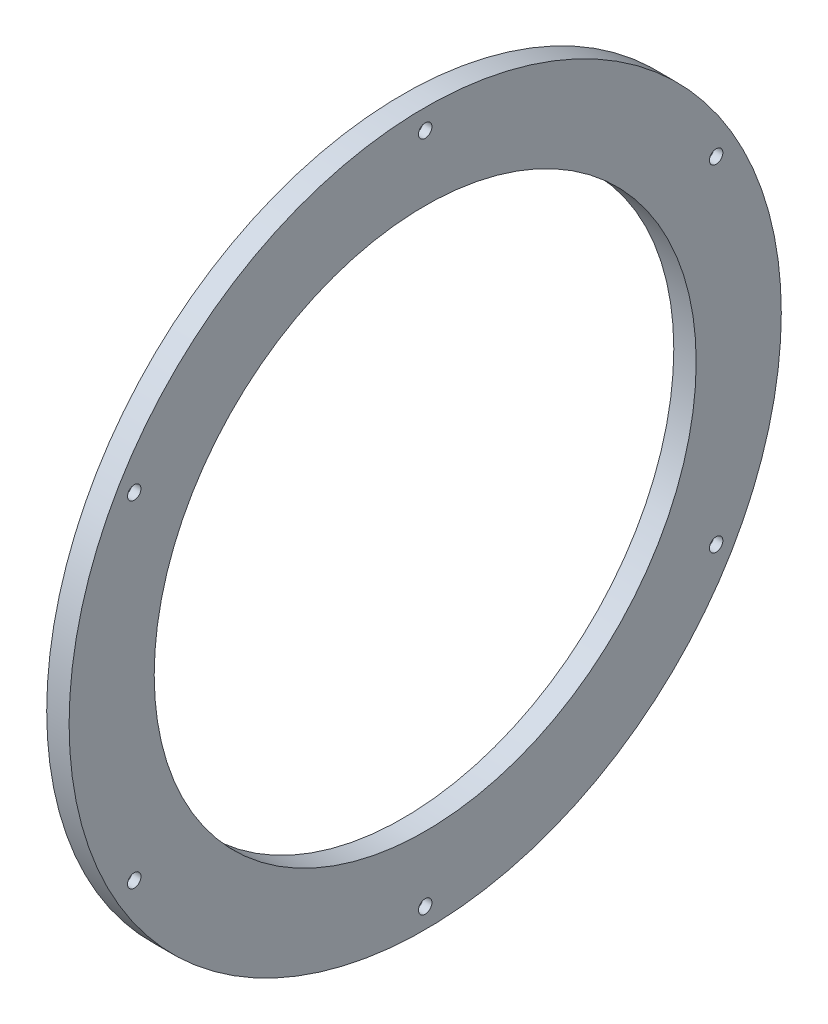
ISO-10303-21;
HEADER;
FILE_DESCRIPTION(('STEP AP214'),'2;1');
FILE_NAME('part.step','',(''),(''),'','','');
FILE_SCHEMA(('AUTOMOTIVE_DESIGN { 1 0 10303 214 1 1 1 1 }'));
ENDSEC;
DATA;
#1=APPLICATION_CONTEXT('core data for automotive mechanical design processes');
#2=APPLICATION_PROTOCOL_DEFINITION('international standard','automotive_design',2000,#1);
#3=PRODUCT_CONTEXT('',#1,'mechanical');
#4=PRODUCT('Part','Part','',(#3));
#5=PRODUCT_RELATED_PRODUCT_CATEGORY('part','',(#4));
#6=PRODUCT_DEFINITION_FORMATION('','',#4);
#7=PRODUCT_DEFINITION_CONTEXT('part definition',#1,'design');
#8=PRODUCT_DEFINITION('design','',#6,#7);
#9=PRODUCT_DEFINITION_SHAPE('','',#8);
#10=(LENGTH_UNIT() NAMED_UNIT(*) SI_UNIT(.MILLI.,.METRE.));
#11=(NAMED_UNIT(*) PLANE_ANGLE_UNIT() SI_UNIT($,.RADIAN.));
#12=(NAMED_UNIT(*) SI_UNIT($,.STERADIAN.) SOLID_ANGLE_UNIT());
#13=UNCERTAINTY_MEASURE_WITH_UNIT(LENGTH_MEASURE(1.E-05),#10,'distance_accuracy_value','');
#14=(GEOMETRIC_REPRESENTATION_CONTEXT(3) GLOBAL_UNCERTAINTY_ASSIGNED_CONTEXT((#13)) GLOBAL_UNIT_ASSIGNED_CONTEXT((#10,
#11,#12)) REPRESENTATION_CONTEXT('',''));
#15=CARTESIAN_POINT('',(0.,0.,0.));
#16=DIRECTION('',(0.,0.,1.));
#17=DIRECTION('',(1.,0.,0.));
#18=AXIS2_PLACEMENT_3D('',#15,#16,#17);
#19=CARTESIAN_POINT('',(10.,0.,0.));
#20=DIRECTION('',(1.,0.,0.));
#21=DIRECTION('',(0.,0.,-1.));
#22=AXIS2_PLACEMENT_3D('',#19,#20,#21);
#23=PLANE('',#22);
#24=CARTESIAN_POINT('',(10.,150.,0.));
#25=DIRECTION('',(1.,0.,0.));
#26=DIRECTION('',(0.,0.,-1.));
#27=AXIS2_PLACEMENT_3D('',#24,#25,#26);
#28=CIRCLE('',#27,3.);
#29=CARTESIAN_POINT('',(10.,150.,-3.));
#30=VERTEX_POINT('',#29);
#31=EDGE_CURVE('E36',#30,#30,#28,.T.);
#32=ORIENTED_EDGE('',*,*,#31,.F.);
#33=EDGE_LOOP('',(#32));
#34=FACE_BOUND('',#33,.T.);
#35=CARTESIAN_POINT('',(10.,74.9999999999997,129.903810567666));
#36=DIRECTION('',(1.,0.,0.));
#37=DIRECTION('',(0.,0.,-1.));
#38=AXIS2_PLACEMENT_3D('',#35,#36,#37);
#39=CIRCLE('',#38,3.);
#40=CARTESIAN_POINT('',(10.,74.9999999999997,126.903810567666));
#41=VERTEX_POINT('',#40);
#42=EDGE_CURVE('E69',#41,#41,#39,.T.);
#43=ORIENTED_EDGE('',*,*,#42,.F.);
#44=EDGE_LOOP('',(#43));
#45=FACE_BOUND('',#44,.T.);
#46=CARTESIAN_POINT('',(10.,-75.0000000000006,129.903810567666));
#47=DIRECTION('',(1.,0.,0.));
#48=DIRECTION('',(0.,0.,-1.));
#49=AXIS2_PLACEMENT_3D('',#46,#47,#48);
#50=CIRCLE('',#49,3.);
#51=CARTESIAN_POINT('',(10.,-75.0000000000006,126.903810567666));
#52=VERTEX_POINT('',#51);
#53=EDGE_CURVE('E65',#52,#52,#50,.T.);
#54=ORIENTED_EDGE('',*,*,#53,.F.);
#55=EDGE_LOOP('',(#54));
#56=FACE_BOUND('',#55,.T.);
#57=CARTESIAN_POINT('',(10.,-150.,-1.04744440165294E-12));
#58=DIRECTION('',(1.,0.,0.));
#59=DIRECTION('',(0.,0.,-1.));
#60=AXIS2_PLACEMENT_3D('',#57,#58,#59);
#61=CIRCLE('',#60,3.);
#62=CARTESIAN_POINT('',(10.,-150.,-3.00000000000105));
#63=VERTEX_POINT('',#62);
#64=EDGE_CURVE('E60',#63,#63,#61,.T.);
#65=ORIENTED_EDGE('',*,*,#64,.F.);
#66=EDGE_LOOP('',(#65));
#67=FACE_BOUND('',#66,.T.);
#68=CARTESIAN_POINT('',(10.,-74.9999999999988,-129.903810567666));
#69=DIRECTION('',(1.,0.,0.));
#70=DIRECTION('',(0.,0.,-1.));
#71=AXIS2_PLACEMENT_3D('',#68,#69,#70);
#72=CIRCLE('',#71,3.);
#73=CARTESIAN_POINT('',(10.,-74.9999999999988,-132.903810567666));
#74=VERTEX_POINT('',#73);
#75=EDGE_CURVE('E55',#74,#74,#72,.T.);
#76=ORIENTED_EDGE('',*,*,#75,.F.);
#77=EDGE_LOOP('',(#76));
#78=FACE_BOUND('',#77,.T.);
#79=CARTESIAN_POINT('',(10.,75.0000000000015,-129.903810567665));
#80=DIRECTION('',(1.,0.,0.));
#81=DIRECTION('',(0.,0.,-1.));
#82=AXIS2_PLACEMENT_3D('',#79,#80,#81);
#83=CIRCLE('',#82,3.);
#84=CARTESIAN_POINT('',(10.,75.0000000000015,-132.903810567665));
#85=VERTEX_POINT('',#84);
#86=EDGE_CURVE('E51',#85,#85,#83,.T.);
#87=ORIENTED_EDGE('',*,*,#86,.F.);
#88=EDGE_LOOP('',(#87));
#89=FACE_BOUND('',#88,.T.);
#90=CARTESIAN_POINT('',(10.,0.,0.));
#91=DIRECTION('',(1.,0.,0.));
#92=DIRECTION('',(0.,0.,-1.));
#93=AXIS2_PLACEMENT_3D('',#90,#91,#92);
#94=CIRCLE('',#93,159.);
#95=CARTESIAN_POINT('',(10.,0.,-159.));
#96=VERTEX_POINT('',#95);
#97=EDGE_CURVE('E10',#96,#96,#94,.T.);
#98=ORIENTED_EDGE('',*,*,#97,.T.);
#99=EDGE_LOOP('',(#98));
#100=FACE_BOUND('',#99,.T.);
#101=CARTESIAN_POINT('',(10.,0.,0.));
#102=DIRECTION('',(1.,0.,0.));
#103=DIRECTION('',(0.,0.,-1.));
#104=AXIS2_PLACEMENT_3D('',#101,#102,#103);
#105=CIRCLE('',#104,121.);
#106=CARTESIAN_POINT('',(10.,0.,-121.));
#107=VERTEX_POINT('',#106);
#108=EDGE_CURVE('E45',#107,#107,#105,.T.);
#109=ORIENTED_EDGE('',*,*,#108,.F.);
#110=EDGE_LOOP('',(#109));
#111=FACE_BOUND('',#110,.T.);
#112=ADVANCED_FACE('F32',(#34,#45,#56,#67,#78,#89,#100,#111),#23,.T.);
#113=CARTESIAN_POINT('',(0.,0.,0.));
#114=DIRECTION('',(1.,0.,0.));
#115=DIRECTION('',(0.,0.,-1.));
#116=AXIS2_PLACEMENT_3D('',#113,#114,#115);
#117=PLANE('',#116);
#118=CARTESIAN_POINT('',(0.,150.,0.));
#119=DIRECTION('',(-1.,0.,0.));
#120=DIRECTION('',(0.,0.,1.));
#121=AXIS2_PLACEMENT_3D('',#118,#119,#120);
#122=CIRCLE('',#121,6.00000000000001);
#123=CARTESIAN_POINT('',(0.,150.,6.00000000000001));
#124=VERTEX_POINT('',#123);
#125=EDGE_CURVE('E237',#124,#124,#122,.T.);
#126=ORIENTED_EDGE('',*,*,#125,.F.);
#127=EDGE_LOOP('',(#126));
#128=FACE_BOUND('',#127,.T.);
#129=CARTESIAN_POINT('',(0.,74.9999999999997,129.903810567666));
#130=DIRECTION('',(-1.,0.,0.));
#131=DIRECTION('',(0.,0.,1.));
#132=AXIS2_PLACEMENT_3D('',#129,#130,#131);
#133=CIRCLE('',#132,5.99999999999999);
#134=CARTESIAN_POINT('',(0.,74.9999999999997,135.903810567666));
#135=VERTEX_POINT('',#134);
#136=EDGE_CURVE('E84',#135,#135,#133,.T.);
#137=ORIENTED_EDGE('',*,*,#136,.F.);
#138=EDGE_LOOP('',(#137));
#139=FACE_BOUND('',#138,.T.);
#140=CARTESIAN_POINT('',(0.,-75.0000000000006,129.903810567666));
#141=DIRECTION('',(-1.,0.,0.));
#142=DIRECTION('',(0.,0.,1.));
#143=AXIS2_PLACEMENT_3D('',#140,#141,#142);
#144=CIRCLE('',#143,5.99999999999999);
#145=CARTESIAN_POINT('',(0.,-75.0000000000006,135.903810567666));
#146=VERTEX_POINT('',#145);
#147=EDGE_CURVE('E71',#146,#146,#144,.T.);
#148=ORIENTED_EDGE('',*,*,#147,.F.);
#149=EDGE_LOOP('',(#148));
#150=FACE_BOUND('',#149,.T.);
#151=CARTESIAN_POINT('',(0.,-150.,-1.04744440165294E-12));
#152=DIRECTION('',(-1.,0.,0.));
#153=DIRECTION('',(0.,0.,1.));
#154=AXIS2_PLACEMENT_3D('',#151,#152,#153);
#155=CIRCLE('',#154,6.00000000000001);
#156=CARTESIAN_POINT('',(0.,-150.,5.99999999999896));
#157=VERTEX_POINT('',#156);
#158=EDGE_CURVE('E67',#157,#157,#155,.T.);
#159=ORIENTED_EDGE('',*,*,#158,.F.);
#160=EDGE_LOOP('',(#159));
#161=FACE_BOUND('',#160,.T.);
#162=CARTESIAN_POINT('',(0.,-74.9999999999988,-129.903810567666));
#163=DIRECTION('',(-1.,0.,0.));
#164=DIRECTION('',(0.,0.,1.));
#165=AXIS2_PLACEMENT_3D('',#162,#163,#164);
#166=CIRCLE('',#165,5.99999999999999);
#167=CARTESIAN_POINT('',(0.,-74.9999999999988,-123.903810567666));
#168=VERTEX_POINT('',#167);
#169=EDGE_CURVE('E63',#168,#168,#166,.T.);
#170=ORIENTED_EDGE('',*,*,#169,.F.);
#171=EDGE_LOOP('',(#170));
#172=FACE_BOUND('',#171,.T.);
#173=CARTESIAN_POINT('',(0.,75.0000000000015,-129.903810567665));
#174=DIRECTION('',(-1.,0.,0.));
#175=DIRECTION('',(0.,0.,1.));
#176=AXIS2_PLACEMENT_3D('',#173,#174,#175);
#177=CIRCLE('',#176,5.99999999999999);
#178=CARTESIAN_POINT('',(0.,75.0000000000015,-123.903810567665));
#179=VERTEX_POINT('',#178);
#180=EDGE_CURVE('E58',#179,#179,#177,.T.);
#181=ORIENTED_EDGE('',*,*,#180,.F.);
#182=EDGE_LOOP('',(#181));
#183=FACE_BOUND('',#182,.T.);
#184=CARTESIAN_POINT('',(0.,0.,0.));
#185=DIRECTION('',(1.,0.,0.));
#186=DIRECTION('',(0.,0.,-1.));
#187=AXIS2_PLACEMENT_3D('',#184,#185,#186);
#188=CIRCLE('',#187,159.);
#189=CARTESIAN_POINT('',(0.,0.,-159.));
#190=VERTEX_POINT('',#189);
#191=EDGE_CURVE('E40',#190,#190,#188,.T.);
#192=ORIENTED_EDGE('',*,*,#191,.F.);
#193=EDGE_LOOP('',(#192));
#194=FACE_BOUND('',#193,.T.);
#195=CARTESIAN_POINT('',(0.,0.,0.));
#196=DIRECTION('',(1.,0.,0.));
#197=DIRECTION('',(0.,0.,-1.));
#198=AXIS2_PLACEMENT_3D('',#195,#196,#197);
#199=CIRCLE('',#198,121.);
#200=CARTESIAN_POINT('',(0.,0.,-121.));
#201=VERTEX_POINT('',#200);
#202=EDGE_CURVE('E48',#201,#201,#199,.T.);
#203=ORIENTED_EDGE('',*,*,#202,.T.);
#204=EDGE_LOOP('',(#203));
#205=FACE_BOUND('',#204,.T.);
#206=ADVANCED_FACE('F118',(#128,#139,#150,#161,#172,#183,#194,#205),#117,.F.);
#207=CARTESIAN_POINT('',(10.,0.,0.));
#208=DIRECTION('',(-1.,0.,0.));
#209=DIRECTION('',(0.,0.,1.));
#210=AXIS2_PLACEMENT_3D('',#207,#208,#209);
#211=CYLINDRICAL_SURFACE('',#210,159.);
#212=ORIENTED_EDGE('',*,*,#97,.F.);
#213=EDGE_LOOP('',(#212));
#214=FACE_BOUND('',#213,.T.);
#215=ORIENTED_EDGE('',*,*,#191,.T.);
#216=EDGE_LOOP('',(#215));
#217=FACE_BOUND('',#216,.T.);
#218=ADVANCED_FACE('F34',(#214,#217),#211,.T.);
#219=CARTESIAN_POINT('',(10.,0.,0.));
#220=DIRECTION('',(-1.,0.,0.));
#221=DIRECTION('',(0.,0.,1.));
#222=AXIS2_PLACEMENT_3D('',#219,#220,#221);
#223=CYLINDRICAL_SURFACE('',#222,121.);
#224=ORIENTED_EDGE('',*,*,#108,.T.);
#225=EDGE_LOOP('',(#224));
#226=FACE_BOUND('',#225,.T.);
#227=ORIENTED_EDGE('',*,*,#202,.F.);
#228=EDGE_LOOP('',(#227));
#229=FACE_BOUND('',#228,.T.);
#230=ADVANCED_FACE('F120',(#226,#229),#223,.F.);
#231=CARTESIAN_POINT('',(0.,75.0000000000015,-129.903810567665));
#232=DIRECTION('',(-1.,0.,0.));
#233=DIRECTION('',(0.,0.,1.));
#234=AXIS2_PLACEMENT_3D('',#231,#232,#233);
#235=CYLINDRICAL_SURFACE('',#234,3.);
#236=ORIENTED_EDGE('',*,*,#86,.T.);
#237=EDGE_LOOP('',(#236));
#238=FACE_BOUND('',#237,.T.);
#239=CARTESIAN_POINT('',(6.,75.0000000000015,-129.903810567665));
#240=DIRECTION('',(-1.,0.,0.));
#241=DIRECTION('',(0.,0.,1.));
#242=AXIS2_PLACEMENT_3D('',#239,#240,#241);
#243=CIRCLE('',#242,3.);
#244=CARTESIAN_POINT('',(6.,75.0000000000015,-126.903810567665));
#245=VERTEX_POINT('',#244);
#246=EDGE_CURVE('E54',#245,#245,#243,.T.);
#247=ORIENTED_EDGE('',*,*,#246,.T.);
#248=EDGE_LOOP('',(#247));
#249=FACE_BOUND('',#248,.T.);
#250=ADVANCED_FACE('F122',(#238,#249),#235,.F.);
#251=CARTESIAN_POINT('',(6.,78.0000000000015,-129.903810567665));
#252=DIRECTION('',(1.,0.,0.));
#253=DIRECTION('',(0.,0.,-1.));
#254=AXIS2_PLACEMENT_3D('',#251,#252,#253);
#255=PLANE('',#254);
#256=ORIENTED_EDGE('',*,*,#246,.F.);
#257=EDGE_LOOP('',(#256));
#258=FACE_BOUND('',#257,.T.);
#259=CARTESIAN_POINT('',(6.,75.0000000000015,-129.903810567665));
#260=DIRECTION('',(-1.,0.,0.));
#261=DIRECTION('',(0.,0.,1.));
#262=AXIS2_PLACEMENT_3D('',#259,#260,#261);
#263=CIRCLE('',#262,5.99999999999999);
#264=CARTESIAN_POINT('',(6.,75.0000000000015,-123.903810567665));
#265=VERTEX_POINT('',#264);
#266=EDGE_CURVE('E108',#265,#265,#263,.T.);
#267=ORIENTED_EDGE('',*,*,#266,.T.);
#268=EDGE_LOOP('',(#267));
#269=FACE_BOUND('',#268,.T.);
#270=ADVANCED_FACE('F128',(#258,#269),#255,.F.);
#271=CARTESIAN_POINT('',(0.,75.0000000000015,-129.903810567665));
#272=DIRECTION('',(-1.,0.,0.));
#273=DIRECTION('',(0.,0.,1.));
#274=AXIS2_PLACEMENT_3D('',#271,#272,#273);
#275=CYLINDRICAL_SURFACE('',#274,5.99999999999999);
#276=ORIENTED_EDGE('',*,*,#266,.F.);
#277=EDGE_LOOP('',(#276));
#278=FACE_BOUND('',#277,.T.);
#279=ORIENTED_EDGE('',*,*,#180,.T.);
#280=EDGE_LOOP('',(#279));
#281=FACE_BOUND('',#280,.T.);
#282=ADVANCED_FACE('F156',(#278,#281),#275,.F.);
#283=CARTESIAN_POINT('',(0.,-74.9999999999988,-129.903810567666));
#284=DIRECTION('',(-1.,0.,0.));
#285=DIRECTION('',(0.,0.,1.));
#286=AXIS2_PLACEMENT_3D('',#283,#284,#285);
#287=CYLINDRICAL_SURFACE('',#286,3.);
#288=ORIENTED_EDGE('',*,*,#75,.T.);
#289=EDGE_LOOP('',(#288));
#290=FACE_BOUND('',#289,.T.);
#291=CARTESIAN_POINT('',(6.,-74.9999999999988,-129.903810567666));
#292=DIRECTION('',(-1.,0.,0.));
#293=DIRECTION('',(0.,0.,1.));
#294=AXIS2_PLACEMENT_3D('',#291,#292,#293);
#295=CIRCLE('',#294,3.);
#296=CARTESIAN_POINT('',(6.,-74.9999999999988,-126.903810567666));
#297=VERTEX_POINT('',#296);
#298=EDGE_CURVE('E59',#297,#297,#295,.T.);
#299=ORIENTED_EDGE('',*,*,#298,.T.);
#300=EDGE_LOOP('',(#299));
#301=FACE_BOUND('',#300,.T.);
#302=ADVANCED_FACE('F162',(#290,#301),#287,.F.);
#303=CARTESIAN_POINT('',(6.,-71.9999999999988,-129.903810567666));
#304=DIRECTION('',(1.,0.,0.));
#305=DIRECTION('',(0.,0.,-1.));
#306=AXIS2_PLACEMENT_3D('',#303,#304,#305);
#307=PLANE('',#306);
#308=ORIENTED_EDGE('',*,*,#298,.F.);
#309=EDGE_LOOP('',(#308));
#310=FACE_BOUND('',#309,.T.);
#311=CARTESIAN_POINT('',(6.,-74.9999999999988,-129.903810567666));
#312=DIRECTION('',(-1.,0.,0.));
#313=DIRECTION('',(0.,0.,1.));
#314=AXIS2_PLACEMENT_3D('',#311,#312,#313);
#315=CIRCLE('',#314,5.99999999999999);
#316=CARTESIAN_POINT('',(6.,-74.9999999999988,-123.903810567666));
#317=VERTEX_POINT('',#316);
#318=EDGE_CURVE('E101',#317,#317,#315,.T.);
#319=ORIENTED_EDGE('',*,*,#318,.T.);
#320=EDGE_LOOP('',(#319));
#321=FACE_BOUND('',#320,.T.);
#322=ADVANCED_FACE('F172',(#310,#321),#307,.F.);
#323=CARTESIAN_POINT('',(0.,-74.9999999999988,-129.903810567666));
#324=DIRECTION('',(-1.,0.,0.));
#325=DIRECTION('',(0.,0.,1.));
#326=AXIS2_PLACEMENT_3D('',#323,#324,#325);
#327=CYLINDRICAL_SURFACE('',#326,5.99999999999999);
#328=ORIENTED_EDGE('',*,*,#318,.F.);
#329=EDGE_LOOP('',(#328));
#330=FACE_BOUND('',#329,.T.);
#331=ORIENTED_EDGE('',*,*,#169,.T.);
#332=EDGE_LOOP('',(#331));
#333=FACE_BOUND('',#332,.T.);
#334=ADVANCED_FACE('F178',(#330,#333),#327,.F.);
#335=CARTESIAN_POINT('',(0.,-150.,-1.04744440165294E-12));
#336=DIRECTION('',(-1.,0.,0.));
#337=DIRECTION('',(0.,0.,1.));
#338=AXIS2_PLACEMENT_3D('',#335,#336,#337);
#339=CYLINDRICAL_SURFACE('',#338,3.);
#340=ORIENTED_EDGE('',*,*,#64,.T.);
#341=EDGE_LOOP('',(#340));
#342=FACE_BOUND('',#341,.T.);
#343=CARTESIAN_POINT('',(6.,-150.,-1.04744440165294E-12));
#344=DIRECTION('',(-1.,0.,0.));
#345=DIRECTION('',(0.,0.,1.));
#346=AXIS2_PLACEMENT_3D('',#343,#344,#345);
#347=CIRCLE('',#346,3.);
#348=CARTESIAN_POINT('',(6.,-150.,2.99999999999896));
#349=VERTEX_POINT('',#348);
#350=EDGE_CURVE('E64',#349,#349,#347,.T.);
#351=ORIENTED_EDGE('',*,*,#350,.T.);
#352=EDGE_LOOP('',(#351));
#353=FACE_BOUND('',#352,.T.);
#354=ADVANCED_FACE('F182',(#342,#353),#339,.F.);
#355=CARTESIAN_POINT('',(6.,-147.,-1.04744440165294E-12));
#356=DIRECTION('',(1.,0.,0.));
#357=DIRECTION('',(0.,0.,-1.));
#358=AXIS2_PLACEMENT_3D('',#355,#356,#357);
#359=PLANE('',#358);
#360=ORIENTED_EDGE('',*,*,#350,.F.);
#361=EDGE_LOOP('',(#360));
#362=FACE_BOUND('',#361,.T.);
#363=CARTESIAN_POINT('',(6.,-150.,-1.04744440165294E-12));
#364=DIRECTION('',(-1.,0.,0.));
#365=DIRECTION('',(0.,0.,1.));
#366=AXIS2_PLACEMENT_3D('',#363,#364,#365);
#367=CIRCLE('',#366,6.00000000000001);
#368=CARTESIAN_POINT('',(6.,-150.,5.99999999999896));
#369=VERTEX_POINT('',#368);
#370=EDGE_CURVE('E94',#369,#369,#367,.T.);
#371=ORIENTED_EDGE('',*,*,#370,.T.);
#372=EDGE_LOOP('',(#371));
#373=FACE_BOUND('',#372,.T.);
#374=ADVANCED_FACE('F186',(#362,#373),#359,.F.);
#375=CARTESIAN_POINT('',(0.,-150.,-1.04744440165294E-12));
#376=DIRECTION('',(-1.,0.,0.));
#377=DIRECTION('',(0.,0.,1.));
#378=AXIS2_PLACEMENT_3D('',#375,#376,#377);
#379=CYLINDRICAL_SURFACE('',#378,6.00000000000001);
#380=ORIENTED_EDGE('',*,*,#370,.F.);
#381=EDGE_LOOP('',(#380));
#382=FACE_BOUND('',#381,.T.);
#383=ORIENTED_EDGE('',*,*,#158,.T.);
#384=EDGE_LOOP('',(#383));
#385=FACE_BOUND('',#384,.T.);
#386=ADVANCED_FACE('F190',(#382,#385),#379,.F.);
#387=CARTESIAN_POINT('',(0.,-75.0000000000006,129.903810567666));
#388=DIRECTION('',(-1.,0.,0.));
#389=DIRECTION('',(0.,0.,1.));
#390=AXIS2_PLACEMENT_3D('',#387,#388,#389);
#391=CYLINDRICAL_SURFACE('',#390,3.);
#392=ORIENTED_EDGE('',*,*,#53,.T.);
#393=EDGE_LOOP('',(#392));
#394=FACE_BOUND('',#393,.T.);
#395=CARTESIAN_POINT('',(6.,-75.0000000000006,129.903810567666));
#396=DIRECTION('',(-1.,0.,0.));
#397=DIRECTION('',(0.,0.,1.));
#398=AXIS2_PLACEMENT_3D('',#395,#396,#397);
#399=CIRCLE('',#398,3.);
#400=CARTESIAN_POINT('',(6.,-75.0000000000006,132.903810567666));
#401=VERTEX_POINT('',#400);
#402=EDGE_CURVE('E68',#401,#401,#399,.T.);
#403=ORIENTED_EDGE('',*,*,#402,.T.);
#404=EDGE_LOOP('',(#403));
#405=FACE_BOUND('',#404,.T.);
#406=ADVANCED_FACE('F194',(#394,#405),#391,.F.);
#407=CARTESIAN_POINT('',(6.,-72.0000000000006,129.903810567666));
#408=DIRECTION('',(1.,0.,0.));
#409=DIRECTION('',(0.,0.,-1.));
#410=AXIS2_PLACEMENT_3D('',#407,#408,#409);
#411=PLANE('',#410);
#412=ORIENTED_EDGE('',*,*,#402,.F.);
#413=EDGE_LOOP('',(#412));
#414=FACE_BOUND('',#413,.T.);
#415=CARTESIAN_POINT('',(6.,-75.0000000000006,129.903810567666));
#416=DIRECTION('',(-1.,0.,0.));
#417=DIRECTION('',(0.,0.,1.));
#418=AXIS2_PLACEMENT_3D('',#415,#416,#417);
#419=CIRCLE('',#418,5.99999999999999);
#420=CARTESIAN_POINT('',(6.,-75.0000000000006,135.903810567666));
#421=VERTEX_POINT('',#420);
#422=EDGE_CURVE('E76',#421,#421,#419,.T.);
#423=ORIENTED_EDGE('',*,*,#422,.T.);
#424=EDGE_LOOP('',(#423));
#425=FACE_BOUND('',#424,.T.);
#426=ADVANCED_FACE('F198',(#414,#425),#411,.F.);
#427=CARTESIAN_POINT('',(0.,-75.0000000000006,129.903810567666));
#428=DIRECTION('',(-1.,0.,0.));
#429=DIRECTION('',(0.,0.,1.));
#430=AXIS2_PLACEMENT_3D('',#427,#428,#429);
#431=CYLINDRICAL_SURFACE('',#430,5.99999999999999);
#432=ORIENTED_EDGE('',*,*,#422,.F.);
#433=EDGE_LOOP('',(#432));
#434=FACE_BOUND('',#433,.T.);
#435=ORIENTED_EDGE('',*,*,#147,.T.);
#436=EDGE_LOOP('',(#435));
#437=FACE_BOUND('',#436,.T.);
#438=ADVANCED_FACE('F202',(#434,#437),#431,.F.);
#439=CARTESIAN_POINT('',(0.,74.9999999999997,129.903810567666));
#440=DIRECTION('',(-1.,0.,0.));
#441=DIRECTION('',(0.,0.,1.));
#442=AXIS2_PLACEMENT_3D('',#439,#440,#441);
#443=CYLINDRICAL_SURFACE('',#442,3.);
#444=ORIENTED_EDGE('',*,*,#42,.T.);
#445=EDGE_LOOP('',(#444));
#446=FACE_BOUND('',#445,.T.);
#447=CARTESIAN_POINT('',(6.,74.9999999999997,129.903810567666));
#448=DIRECTION('',(-1.,0.,0.));
#449=DIRECTION('',(0.,0.,1.));
#450=AXIS2_PLACEMENT_3D('',#447,#448,#449);
#451=CIRCLE('',#450,3.);
#452=CARTESIAN_POINT('',(6.,74.9999999999997,132.903810567666));
#453=VERTEX_POINT('',#452);
#454=EDGE_CURVE('E72',#453,#453,#451,.T.);
#455=ORIENTED_EDGE('',*,*,#454,.T.);
#456=EDGE_LOOP('',(#455));
#457=FACE_BOUND('',#456,.T.);
#458=ADVANCED_FACE('F206',(#446,#457),#443,.F.);
#459=CARTESIAN_POINT('',(6.,77.9999999999997,129.903810567666));
#460=DIRECTION('',(1.,0.,0.));
#461=DIRECTION('',(0.,0.,-1.));
#462=AXIS2_PLACEMENT_3D('',#459,#460,#461);
#463=PLANE('',#462);
#464=ORIENTED_EDGE('',*,*,#454,.F.);
#465=EDGE_LOOP('',(#464));
#466=FACE_BOUND('',#465,.T.);
#467=CARTESIAN_POINT('',(6.,74.9999999999997,129.903810567666));
#468=DIRECTION('',(-1.,0.,0.));
#469=DIRECTION('',(0.,0.,1.));
#470=AXIS2_PLACEMENT_3D('',#467,#468,#469);
#471=CIRCLE('',#470,5.99999999999999);
#472=CARTESIAN_POINT('',(6.,74.9999999999997,135.903810567666));
#473=VERTEX_POINT('',#472);
#474=EDGE_CURVE('E79',#473,#473,#471,.T.);
#475=ORIENTED_EDGE('',*,*,#474,.T.);
#476=EDGE_LOOP('',(#475));
#477=FACE_BOUND('',#476,.T.);
#478=ADVANCED_FACE('F210',(#466,#477),#463,.F.);
#479=CARTESIAN_POINT('',(0.,74.9999999999997,129.903810567666));
#480=DIRECTION('',(-1.,0.,0.));
#481=DIRECTION('',(0.,0.,1.));
#482=AXIS2_PLACEMENT_3D('',#479,#480,#481);
#483=CYLINDRICAL_SURFACE('',#482,5.99999999999999);
#484=ORIENTED_EDGE('',*,*,#474,.F.);
#485=EDGE_LOOP('',(#484));
#486=FACE_BOUND('',#485,.T.);
#487=ORIENTED_EDGE('',*,*,#136,.T.);
#488=EDGE_LOOP('',(#487));
#489=FACE_BOUND('',#488,.T.);
#490=ADVANCED_FACE('F213',(#486,#489),#483,.F.);
#491=CARTESIAN_POINT('',(0.,150.,0.));
#492=DIRECTION('',(-1.,0.,0.));
#493=DIRECTION('',(0.,0.,1.));
#494=AXIS2_PLACEMENT_3D('',#491,#492,#493);
#495=CYLINDRICAL_SURFACE('',#494,3.);
#496=ORIENTED_EDGE('',*,*,#31,.T.);
#497=EDGE_LOOP('',(#496));
#498=FACE_BOUND('',#497,.T.);
#499=CARTESIAN_POINT('',(6.,150.,0.));
#500=DIRECTION('',(-1.,0.,0.));
#501=DIRECTION('',(0.,0.,1.));
#502=AXIS2_PLACEMENT_3D('',#499,#500,#501);
#503=CIRCLE('',#502,3.);
#504=CARTESIAN_POINT('',(6.,150.,3.));
#505=VERTEX_POINT('',#504);
#506=EDGE_CURVE('E239',#505,#505,#503,.T.);
#507=ORIENTED_EDGE('',*,*,#506,.T.);
#508=EDGE_LOOP('',(#507));
#509=FACE_BOUND('',#508,.T.);
#510=ADVANCED_FACE('F217',(#498,#509),#495,.F.);
#511=CARTESIAN_POINT('',(6.,153.,0.));
#512=DIRECTION('',(1.,0.,0.));
#513=DIRECTION('',(0.,0.,-1.));
#514=AXIS2_PLACEMENT_3D('',#511,#512,#513);
#515=PLANE('',#514);
#516=ORIENTED_EDGE('',*,*,#506,.F.);
#517=EDGE_LOOP('',(#516));
#518=FACE_BOUND('',#517,.T.);
#519=CARTESIAN_POINT('',(6.,150.,0.));
#520=DIRECTION('',(-1.,0.,0.));
#521=DIRECTION('',(0.,0.,1.));
#522=AXIS2_PLACEMENT_3D('',#519,#520,#521);
#523=CIRCLE('',#522,6.00000000000001);
#524=CARTESIAN_POINT('',(6.,150.,6.00000000000001));
#525=VERTEX_POINT('',#524);
#526=EDGE_CURVE('E234',#525,#525,#523,.T.);
#527=ORIENTED_EDGE('',*,*,#526,.T.);
#528=EDGE_LOOP('',(#527));
#529=FACE_BOUND('',#528,.T.);
#530=ADVANCED_FACE('F221',(#518,#529),#515,.F.);
#531=CARTESIAN_POINT('',(0.,150.,0.));
#532=DIRECTION('',(-1.,0.,0.));
#533=DIRECTION('',(0.,0.,1.));
#534=AXIS2_PLACEMENT_3D('',#531,#532,#533);
#535=CYLINDRICAL_SURFACE('',#534,6.00000000000001);
#536=ORIENTED_EDGE('',*,*,#526,.F.);
#537=EDGE_LOOP('',(#536));
#538=FACE_BOUND('',#537,.T.);
#539=ORIENTED_EDGE('',*,*,#125,.T.);
#540=EDGE_LOOP('',(#539));
#541=FACE_BOUND('',#540,.T.);
#542=ADVANCED_FACE('F225',(#538,#541),#535,.F.);
#543=CLOSED_SHELL('',(#112,#206,#218,#230,#250,#270,#282,#302,#322,#334,#354,#374,#386,#406,
#426,#438,#458,#478,#490,#510,#530,#542));
#544=MANIFOLD_SOLID_BREP('B2',#543);
#545=ADVANCED_BREP_SHAPE_REPRESENTATION('',(#18,#544),#14);
#546=SHAPE_DEFINITION_REPRESENTATION(#9,#545);
ENDSEC;
END-ISO-10303-21;
